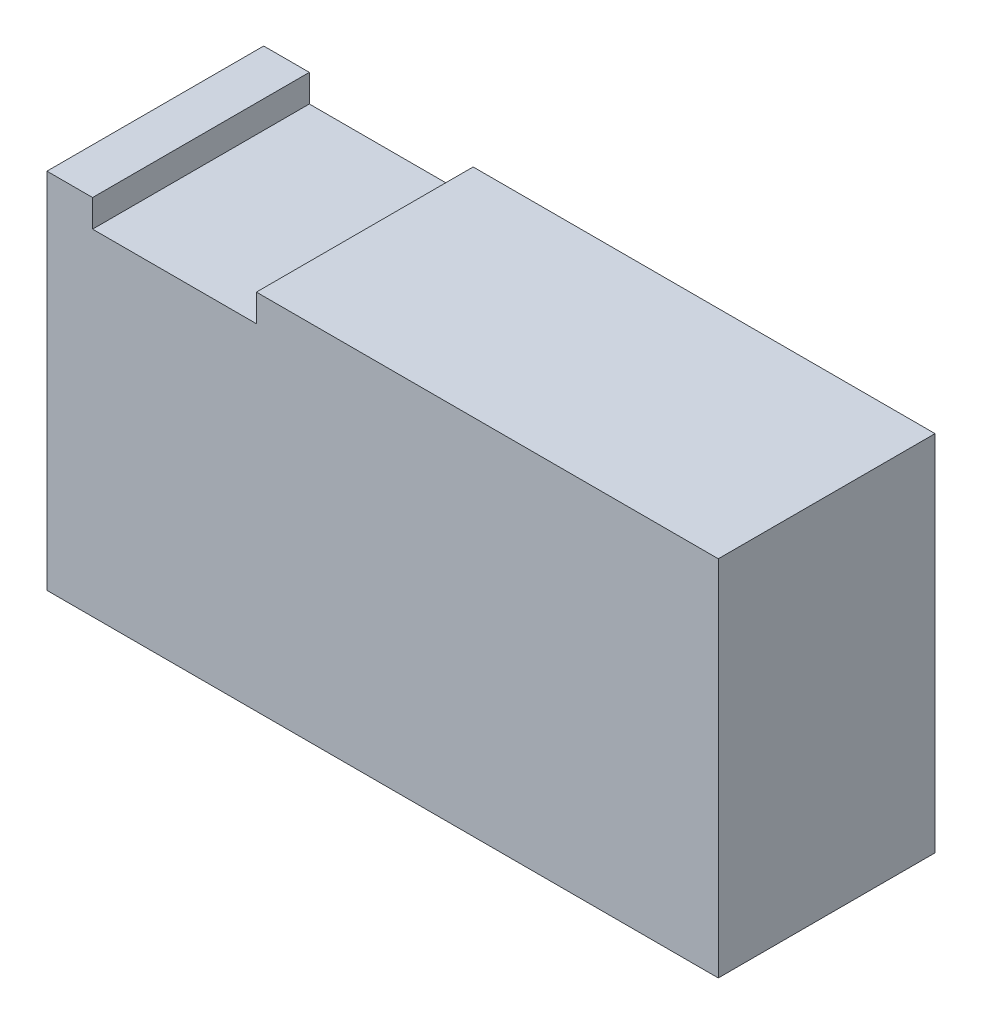
ISO-10303-21;
HEADER;
FILE_DESCRIPTION(('STEP AP214'),'2;1');
FILE_NAME('part.step','',(''),(''),'','','');
FILE_SCHEMA(('AUTOMOTIVE_DESIGN { 1 0 10303 214 1 1 1 1 }'));
ENDSEC;
DATA;
#1=APPLICATION_CONTEXT('core data for automotive mechanical design processes');
#2=APPLICATION_PROTOCOL_DEFINITION('international standard','automotive_design',2000,#1);
#3=PRODUCT_CONTEXT('',#1,'mechanical');
#4=PRODUCT('Part','Part','',(#3));
#5=PRODUCT_RELATED_PRODUCT_CATEGORY('part','',(#4));
#6=PRODUCT_DEFINITION_FORMATION('','',#4);
#7=PRODUCT_DEFINITION_CONTEXT('part definition',#1,'design');
#8=PRODUCT_DEFINITION('design','',#6,#7);
#9=PRODUCT_DEFINITION_SHAPE('','',#8);
#10=(LENGTH_UNIT() NAMED_UNIT(*) SI_UNIT(.MILLI.,.METRE.));
#11=(NAMED_UNIT(*) PLANE_ANGLE_UNIT() SI_UNIT($,.RADIAN.));
#12=(NAMED_UNIT(*) SI_UNIT($,.STERADIAN.) SOLID_ANGLE_UNIT());
#13=UNCERTAINTY_MEASURE_WITH_UNIT(LENGTH_MEASURE(1.E-05),#10,'distance_accuracy_value','');
#14=(GEOMETRIC_REPRESENTATION_CONTEXT(3) GLOBAL_UNCERTAINTY_ASSIGNED_CONTEXT((#13)) GLOBAL_UNIT_ASSIGNED_CONTEXT((#10,
#11,#12)) REPRESENTATION_CONTEXT('',''));
#15=CARTESIAN_POINT('',(0.,0.,0.));
#16=DIRECTION('',(0.,0.,1.));
#17=DIRECTION('',(1.,0.,0.));
#18=AXIS2_PLACEMENT_3D('',#15,#16,#17);
#19=CARTESIAN_POINT('',(0.,33.8,0.));
#20=DIRECTION('',(0.,-1.,0.));
#21=DIRECTION('',(0.,0.,-1.));
#22=AXIS2_PLACEMENT_3D('',#19,#20,#21);
#23=PLANE('',#22);
#24=DIRECTION('',(1.,0.,0.));
#25=VECTOR('',#24,1.);
#26=CARTESIAN_POINT('',(-31.25,33.8,10.09));
#27=LINE('',#26,#25);
#28=CARTESIAN_POINT('',(-31.25,33.8,10.09));
#29=VERTEX_POINT('',#28);
#30=CARTESIAN_POINT('',(-27.,33.8,10.09));
#31=VERTEX_POINT('',#30);
#32=EDGE_CURVE('E174',#29,#31,#27,.T.);
#33=ORIENTED_EDGE('',*,*,#32,.T.);
#34=DIRECTION('',(0.,0.,1.));
#35=VECTOR('',#34,1.);
#36=CARTESIAN_POINT('',(-27.,33.8,-10.09));
#37=LINE('',#36,#35);
#38=CARTESIAN_POINT('',(-27.,33.8,-10.09));
#39=VERTEX_POINT('',#38);
#40=EDGE_CURVE('E126',#39,#31,#37,.T.);
#41=ORIENTED_EDGE('',*,*,#40,.F.);
#42=DIRECTION('',(-1.,0.,0.));
#43=VECTOR('',#42,1.);
#44=CARTESIAN_POINT('',(-31.25,33.8,-10.09));
#45=LINE('',#44,#43);
#46=CARTESIAN_POINT('',(-31.25,33.8,-10.09));
#47=VERTEX_POINT('',#46);
#48=EDGE_CURVE('E168',#39,#47,#45,.T.);
#49=ORIENTED_EDGE('',*,*,#48,.T.);
#50=DIRECTION('',(0.,0.,1.));
#51=VECTOR('',#50,1.);
#52=CARTESIAN_POINT('',(-31.25,33.8,10.09));
#53=LINE('',#52,#51);
#54=EDGE_CURVE('E171',#47,#29,#53,.T.);
#55=ORIENTED_EDGE('',*,*,#54,.T.);
#56=EDGE_LOOP('',(#33,#41,#49,#55));
#57=FACE_BOUND('',#56,.T.);
#58=ADVANCED_FACE('F45',(#57),#23,.F.);
#59=CARTESIAN_POINT('',(31.25,33.8,10.09));
#60=DIRECTION('',(-1.,0.,0.));
#61=DIRECTION('',(0.,0.,1.));
#62=AXIS2_PLACEMENT_3D('',#59,#60,#61);
#63=PLANE('',#62);
#64=DIRECTION('',(0.,0.,-1.));
#65=VECTOR('',#64,1.);
#66=CARTESIAN_POINT('',(31.25,0.,10.09));
#67=LINE('',#66,#65);
#68=CARTESIAN_POINT('',(31.25,0.,10.09));
#69=VERTEX_POINT('',#68);
#70=CARTESIAN_POINT('',(31.25,0.,-10.09));
#71=VERTEX_POINT('',#70);
#72=EDGE_CURVE('E159',#69,#71,#67,.T.);
#73=ORIENTED_EDGE('',*,*,#72,.T.);
#74=DIRECTION('',(0.,-1.,0.));
#75=VECTOR('',#74,1.);
#76=CARTESIAN_POINT('',(31.25,33.8,-10.09));
#77=LINE('',#76,#75);
#78=CARTESIAN_POINT('',(31.25,33.8,-10.09));
#79=VERTEX_POINT('',#78);
#80=EDGE_CURVE('E11',#79,#71,#77,.T.);
#81=ORIENTED_EDGE('',*,*,#80,.F.);
#82=DIRECTION('',(0.,0.,-1.));
#83=VECTOR('',#82,1.);
#84=CARTESIAN_POINT('',(31.25,33.8,10.09));
#85=LINE('',#84,#83);
#86=CARTESIAN_POINT('',(31.25,33.8,10.09));
#87=VERTEX_POINT('',#86);
#88=EDGE_CURVE('E165',#87,#79,#85,.T.);
#89=ORIENTED_EDGE('',*,*,#88,.F.);
#90=DIRECTION('',(0.,-1.,0.));
#91=VECTOR('',#90,1.);
#92=CARTESIAN_POINT('',(31.25,33.8,10.09));
#93=LINE('',#92,#91);
#94=EDGE_CURVE('E177',#87,#69,#93,.T.);
#95=ORIENTED_EDGE('',*,*,#94,.T.);
#96=EDGE_LOOP('',(#73,#81,#89,#95));
#97=FACE_BOUND('',#96,.T.);
#98=ADVANCED_FACE('F47',(#97),#63,.F.);
#99=CARTESIAN_POINT('',(-31.25,33.8,-10.09));
#100=DIRECTION('',(0.,0.,1.));
#101=DIRECTION('',(1.,0.,0.));
#102=AXIS2_PLACEMENT_3D('',#99,#100,#101);
#103=PLANE('',#102);
#104=ORIENTED_EDGE('',*,*,#48,.F.);
#105=DIRECTION('',(0.,1.,0.));
#106=VECTOR('',#105,1.);
#107=CARTESIAN_POINT('',(-27.,31.25,-10.09));
#108=LINE('',#107,#106);
#109=CARTESIAN_POINT('',(-27.,31.25,-10.09));
#110=VERTEX_POINT('',#109);
#111=EDGE_CURVE('E156',#110,#39,#108,.T.);
#112=ORIENTED_EDGE('',*,*,#111,.F.);
#113=DIRECTION('',(-1.,0.,0.));
#114=VECTOR('',#113,1.);
#115=CARTESIAN_POINT('',(-27.,31.25,-10.09));
#116=LINE('',#115,#114);
#117=CARTESIAN_POINT('',(-11.75,31.25,-10.09));
#118=VERTEX_POINT('',#117);
#119=EDGE_CURVE('E131',#118,#110,#116,.T.);
#120=ORIENTED_EDGE('',*,*,#119,.F.);
#121=DIRECTION('',(0.,1.,0.));
#122=VECTOR('',#121,1.);
#123=CARTESIAN_POINT('',(-11.75,31.25,-10.09));
#124=LINE('',#123,#122);
#125=CARTESIAN_POINT('',(-11.75,33.8,-10.09));
#126=VERTEX_POINT('',#125);
#127=EDGE_CURVE('E160',#118,#126,#124,.T.);
#128=ORIENTED_EDGE('',*,*,#127,.T.);
#129=EDGE_CURVE('E98',#79,#126,#45,.T.);
#130=ORIENTED_EDGE('',*,*,#129,.F.);
#131=ORIENTED_EDGE('',*,*,#80,.T.);
#132=DIRECTION('',(-1.,0.,0.));
#133=VECTOR('',#132,1.);
#134=CARTESIAN_POINT('',(-31.25,0.,-10.09));
#135=LINE('',#134,#133);
#136=CARTESIAN_POINT('',(-31.25,0.,-10.09));
#137=VERTEX_POINT('',#136);
#138=EDGE_CURVE('E181',#71,#137,#135,.T.);
#139=ORIENTED_EDGE('',*,*,#138,.T.);
#140=DIRECTION('',(0.,-1.,0.));
#141=VECTOR('',#140,1.);
#142=CARTESIAN_POINT('',(-31.25,33.8,-10.09));
#143=LINE('',#142,#141);
#144=EDGE_CURVE('E54',#47,#137,#143,.T.);
#145=ORIENTED_EDGE('',*,*,#144,.F.);
#146=EDGE_LOOP('',(#104,#112,#120,#128,#130,#131,#139,#145));
#147=FACE_BOUND('',#146,.T.);
#148=ADVANCED_FACE('F211',(#147),#103,.F.);
#149=CARTESIAN_POINT('',(-31.25,33.8,10.09));
#150=DIRECTION('',(1.,0.,0.));
#151=DIRECTION('',(0.,0.,-1.));
#152=AXIS2_PLACEMENT_3D('',#149,#150,#151);
#153=PLANE('',#152);
#154=DIRECTION('',(0.,0.,1.));
#155=VECTOR('',#154,1.);
#156=CARTESIAN_POINT('',(-31.25,0.,10.09));
#157=LINE('',#156,#155);
#158=CARTESIAN_POINT('',(-31.25,0.,10.09));
#159=VERTEX_POINT('',#158);
#160=EDGE_CURVE('E184',#137,#159,#157,.T.);
#161=ORIENTED_EDGE('',*,*,#160,.T.);
#162=DIRECTION('',(0.,-1.,0.));
#163=VECTOR('',#162,1.);
#164=CARTESIAN_POINT('',(-31.25,33.8,10.09));
#165=LINE('',#164,#163);
#166=EDGE_CURVE('E191',#29,#159,#165,.T.);
#167=ORIENTED_EDGE('',*,*,#166,.F.);
#168=ORIENTED_EDGE('',*,*,#54,.F.);
#169=ORIENTED_EDGE('',*,*,#144,.T.);
#170=EDGE_LOOP('',(#161,#167,#168,#169));
#171=FACE_BOUND('',#170,.T.);
#172=ADVANCED_FACE('F199',(#171),#153,.F.);
#173=CARTESIAN_POINT('',(-31.25,33.8,10.09));
#174=DIRECTION('',(0.,0.,-1.));
#175=DIRECTION('',(-1.,0.,0.));
#176=AXIS2_PLACEMENT_3D('',#173,#174,#175);
#177=PLANE('',#176);
#178=DIRECTION('',(1.,0.,0.));
#179=VECTOR('',#178,1.);
#180=CARTESIAN_POINT('',(-27.,31.25,10.09));
#181=LINE('',#180,#179);
#182=CARTESIAN_POINT('',(-27.,31.25,10.09));
#183=VERTEX_POINT('',#182);
#184=CARTESIAN_POINT('',(-11.75,31.25,10.09));
#185=VERTEX_POINT('',#184);
#186=EDGE_CURVE('E137',#183,#185,#181,.T.);
#187=ORIENTED_EDGE('',*,*,#186,.F.);
#188=DIRECTION('',(0.,1.,0.));
#189=VECTOR('',#188,1.);
#190=CARTESIAN_POINT('',(-27.,31.25,10.09));
#191=LINE('',#190,#189);
#192=EDGE_CURVE('E120',#183,#31,#191,.T.);
#193=ORIENTED_EDGE('',*,*,#192,.T.);
#194=ORIENTED_EDGE('',*,*,#32,.F.);
#195=ORIENTED_EDGE('',*,*,#166,.T.);
#196=DIRECTION('',(1.,0.,0.));
#197=VECTOR('',#196,1.);
#198=CARTESIAN_POINT('',(-31.25,0.,10.09));
#199=LINE('',#198,#197);
#200=EDGE_CURVE('E91',#159,#69,#199,.T.);
#201=ORIENTED_EDGE('',*,*,#200,.T.);
#202=ORIENTED_EDGE('',*,*,#94,.F.);
#203=CARTESIAN_POINT('',(-11.75,33.8,10.09));
#204=VERTEX_POINT('',#203);
#205=EDGE_CURVE('E69',#204,#87,#27,.T.);
#206=ORIENTED_EDGE('',*,*,#205,.F.);
#207=DIRECTION('',(0.,1.,0.));
#208=VECTOR('',#207,1.);
#209=CARTESIAN_POINT('',(-11.75,31.25,10.09));
#210=LINE('',#209,#208);
#211=EDGE_CURVE('E61',#185,#204,#210,.T.);
#212=ORIENTED_EDGE('',*,*,#211,.F.);
#213=EDGE_LOOP('',(#187,#193,#194,#195,#201,#202,#206,#212));
#214=FACE_BOUND('',#213,.T.);
#215=ADVANCED_FACE('F143',(#214),#177,.F.);
#216=ORIENTED_EDGE('',*,*,#129,.T.);
#217=DIRECTION('',(0.,0.,-1.));
#218=VECTOR('',#217,1.);
#219=CARTESIAN_POINT('',(-11.75,33.8,-10.09));
#220=LINE('',#219,#218);
#221=EDGE_CURVE('E141',#204,#126,#220,.T.);
#222=ORIENTED_EDGE('',*,*,#221,.F.);
#223=ORIENTED_EDGE('',*,*,#205,.T.);
#224=ORIENTED_EDGE('',*,*,#88,.T.);
#225=EDGE_LOOP('',(#216,#222,#223,#224));
#226=FACE_BOUND('',#225,.T.);
#227=ADVANCED_FACE('F212',(#226),#23,.F.);
#228=CARTESIAN_POINT('',(0.,0.,0.));
#229=DIRECTION('',(0.,-1.,0.));
#230=DIRECTION('',(0.,0.,-1.));
#231=AXIS2_PLACEMENT_3D('',#228,#229,#230);
#232=PLANE('',#231);
#233=ORIENTED_EDGE('',*,*,#72,.F.);
#234=ORIENTED_EDGE('',*,*,#200,.F.);
#235=ORIENTED_EDGE('',*,*,#160,.F.);
#236=ORIENTED_EDGE('',*,*,#138,.F.);
#237=EDGE_LOOP('',(#233,#234,#235,#236));
#238=FACE_BOUND('',#237,.T.);
#239=ADVANCED_FACE('F204',(#238),#232,.T.);
#240=CARTESIAN_POINT('',(-27.,31.25,-10.09));
#241=DIRECTION('',(-1.,0.,0.));
#242=DIRECTION('',(0.,0.,1.));
#243=AXIS2_PLACEMENT_3D('',#240,#241,#242);
#244=PLANE('',#243);
#245=ORIENTED_EDGE('',*,*,#40,.T.);
#246=ORIENTED_EDGE('',*,*,#192,.F.);
#247=DIRECTION('',(0.,0.,1.));
#248=VECTOR('',#247,1.);
#249=CARTESIAN_POINT('',(-27.,31.25,-10.09));
#250=LINE('',#249,#248);
#251=EDGE_CURVE('E123',#110,#183,#250,.T.);
#252=ORIENTED_EDGE('',*,*,#251,.F.);
#253=ORIENTED_EDGE('',*,*,#111,.T.);
#254=EDGE_LOOP('',(#245,#246,#252,#253));
#255=FACE_BOUND('',#254,.T.);
#256=ADVANCED_FACE('F122',(#255),#244,.F.);
#257=CARTESIAN_POINT('',(-11.75,31.25,-10.09));
#258=DIRECTION('',(1.,0.,0.));
#259=DIRECTION('',(0.,0.,-1.));
#260=AXIS2_PLACEMENT_3D('',#257,#258,#259);
#261=PLANE('',#260);
#262=ORIENTED_EDGE('',*,*,#221,.T.);
#263=ORIENTED_EDGE('',*,*,#127,.F.);
#264=DIRECTION('',(0.,0.,-1.));
#265=VECTOR('',#264,1.);
#266=CARTESIAN_POINT('',(-11.75,31.25,-10.09));
#267=LINE('',#266,#265);
#268=EDGE_CURVE('E145',#185,#118,#267,.T.);
#269=ORIENTED_EDGE('',*,*,#268,.F.);
#270=ORIENTED_EDGE('',*,*,#211,.T.);
#271=EDGE_LOOP('',(#262,#263,#269,#270));
#272=FACE_BOUND('',#271,.T.);
#273=ADVANCED_FACE('F213',(#272),#261,.F.);
#274=CARTESIAN_POINT('',(0.,31.25,0.));
#275=DIRECTION('',(0.,1.,0.));
#276=DIRECTION('',(0.,0.,1.));
#277=AXIS2_PLACEMENT_3D('',#274,#275,#276);
#278=PLANE('',#277);
#279=ORIENTED_EDGE('',*,*,#251,.T.);
#280=ORIENTED_EDGE('',*,*,#186,.T.);
#281=ORIENTED_EDGE('',*,*,#268,.T.);
#282=ORIENTED_EDGE('',*,*,#119,.T.);
#283=EDGE_LOOP('',(#279,#280,#281,#282));
#284=FACE_BOUND('',#283,.T.);
#285=ADVANCED_FACE('F135',(#284),#278,.T.);
#286=CLOSED_SHELL('',(#58,#98,#148,#172,#215,#227,#239,#256,#273,#285));
#287=MANIFOLD_SOLID_BREP('B2',#286);
#288=ADVANCED_BREP_SHAPE_REPRESENTATION('',(#18,#287),#14);
#289=SHAPE_DEFINITION_REPRESENTATION(#9,#288);
ENDSEC;
END-ISO-10303-21;
